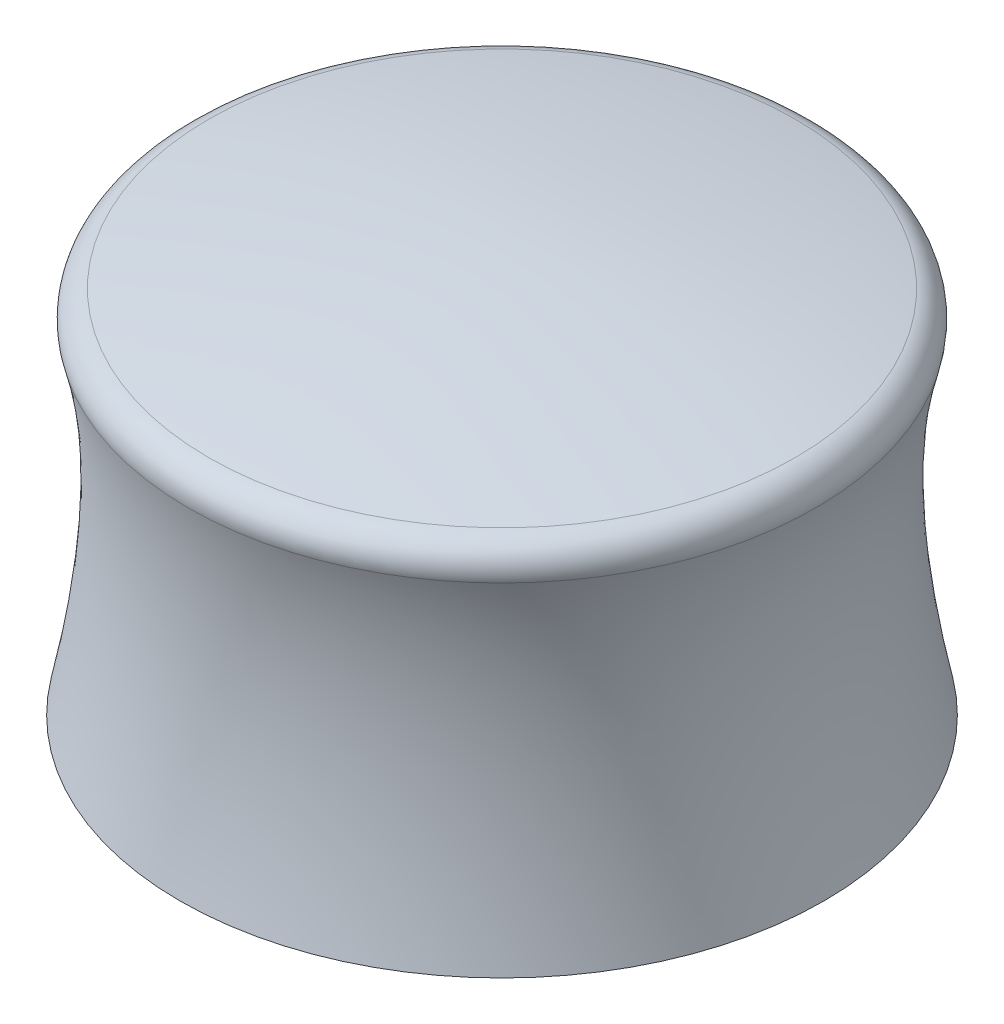
ISO-10303-21;
HEADER;
FILE_DESCRIPTION(('STEP AP214'),'2;1');
FILE_NAME('part.step','',(''),(''),'','','');
FILE_SCHEMA(('AUTOMOTIVE_DESIGN { 1 0 10303 214 1 1 1 1 }'));
ENDSEC;
DATA;
#1=APPLICATION_CONTEXT('core data for automotive mechanical design processes');
#2=APPLICATION_PROTOCOL_DEFINITION('international standard','automotive_design',2000,#1);
#3=PRODUCT_CONTEXT('',#1,'mechanical');
#4=PRODUCT('Part','Part','',(#3));
#5=PRODUCT_RELATED_PRODUCT_CATEGORY('part','',(#4));
#6=PRODUCT_DEFINITION_FORMATION('','',#4);
#7=PRODUCT_DEFINITION_CONTEXT('part definition',#1,'design');
#8=PRODUCT_DEFINITION('design','',#6,#7);
#9=PRODUCT_DEFINITION_SHAPE('','',#8);
#10=(LENGTH_UNIT() NAMED_UNIT(*) SI_UNIT(.MILLI.,.METRE.));
#11=(NAMED_UNIT(*) PLANE_ANGLE_UNIT() SI_UNIT($,.RADIAN.));
#12=(NAMED_UNIT(*) SI_UNIT($,.STERADIAN.) SOLID_ANGLE_UNIT());
#13=UNCERTAINTY_MEASURE_WITH_UNIT(LENGTH_MEASURE(1.E-05),#10,'distance_accuracy_value','');
#14=(GEOMETRIC_REPRESENTATION_CONTEXT(3) GLOBAL_UNCERTAINTY_ASSIGNED_CONTEXT((#13)) GLOBAL_UNIT_ASSIGNED_CONTEXT((#10,
#11,#12)) REPRESENTATION_CONTEXT('',''));
#15=CARTESIAN_POINT('',(0.,0.,0.));
#16=DIRECTION('',(0.,0.,1.));
#17=DIRECTION('',(1.,0.,0.));
#18=AXIS2_PLACEMENT_3D('',#15,#16,#17);
#19=CARTESIAN_POINT('',(0.,-1.,0.));
#20=DIRECTION('',(0.,1.,0.));
#21=DIRECTION('',(0.,0.,1.));
#22=AXIS2_PLACEMENT_3D('',#19,#20,#21);
#23=CYLINDRICAL_SURFACE('',#22,10.);
#24=CARTESIAN_POINT('',(0.,-1.,0.));
#25=DIRECTION('',(0.,1.,0.));
#26=DIRECTION('',(0.,0.,1.));
#27=AXIS2_PLACEMENT_3D('',#24,#25,#26);
#28=CIRCLE('',#27,10.);
#29=CARTESIAN_POINT('',(0.,-1.,10.));
#30=VERTEX_POINT('',#29);
#31=EDGE_CURVE('E65',#30,#30,#28,.T.);
#32=ORIENTED_EDGE('',*,*,#31,.T.);
#33=EDGE_LOOP('',(#32));
#34=FACE_BOUND('',#33,.T.);
#35=CARTESIAN_POINT('',(0.,-0.564405203894367,0.));
#36=DIRECTION('',(0.,1.,0.));
#37=DIRECTION('',(0.,0.,1.));
#38=AXIS2_PLACEMENT_3D('',#35,#36,#37);
#39=CIRCLE('',#38,10.);
#40=CARTESIAN_POINT('',(0.,-0.564405203894368,10.));
#41=VERTEX_POINT('',#40);
#42=EDGE_CURVE('E89',#41,#41,#39,.T.);
#43=ORIENTED_EDGE('',*,*,#42,.F.);
#44=EDGE_LOOP('',(#43));
#45=FACE_BOUND('',#44,.T.);
#46=ADVANCED_FACE('F35',(#34,#45),#23,.T.);
#47=CARTESIAN_POINT('',(0.,-1.,0.));
#48=DIRECTION('',(0.,1.,0.));
#49=DIRECTION('',(0.,0.,1.));
#50=AXIS2_PLACEMENT_3D('',#47,#48,#49);
#51=PLANE('',#50);
#52=CARTESIAN_POINT('',(0.,-1.,0.));
#53=DIRECTION('',(0.,-1.,0.));
#54=DIRECTION('',(0.,0.,-1.));
#55=AXIS2_PLACEMENT_3D('',#52,#53,#54);
#56=CIRCLE('',#55,3.);
#57=CARTESIAN_POINT('',(0.,-1.,-3.));
#58=VERTEX_POINT('',#57);
#59=CARTESIAN_POINT('',(2.59807621135332,-1.,1.5));
#60=VERTEX_POINT('',#59);
#61=EDGE_CURVE('E81',#58,#60,#56,.T.);
#62=ORIENTED_EDGE('',*,*,#61,.F.);
#63=CARTESIAN_POINT('',(0.,-1.,-6.));
#64=DIRECTION('',(0.,1.,0.));
#65=DIRECTION('',(0.,0.,1.));
#66=AXIS2_PLACEMENT_3D('',#63,#64,#65);
#67=CIRCLE('',#66,3.);
#68=EDGE_CURVE('E61',#58,#58,#67,.T.);
#69=ORIENTED_EDGE('',*,*,#68,.T.);
#70=CARTESIAN_POINT('',(-2.59807621135332,-1.,1.5));
#71=VERTEX_POINT('',#70);
#72=EDGE_CURVE('E50',#71,#58,#56,.T.);
#73=ORIENTED_EDGE('',*,*,#72,.F.);
#74=CARTESIAN_POINT('',(-5.19615242270663,-1.,3.));
#75=DIRECTION('',(0.,1.,0.));
#76=DIRECTION('',(0.,0.,1.));
#77=AXIS2_PLACEMENT_3D('',#74,#75,#76);
#78=CIRCLE('',#77,3.);
#79=EDGE_CURVE('E66',#71,#71,#78,.T.);
#80=ORIENTED_EDGE('',*,*,#79,.T.);
#81=EDGE_CURVE('E43',#60,#71,#56,.T.);
#82=ORIENTED_EDGE('',*,*,#81,.F.);
#83=CARTESIAN_POINT('',(5.19615242270663,-1.,3.));
#84=DIRECTION('',(0.,1.,0.));
#85=DIRECTION('',(0.,0.,1.));
#86=AXIS2_PLACEMENT_3D('',#83,#84,#85);
#87=CIRCLE('',#86,3.);
#88=EDGE_CURVE('E71',#60,#60,#87,.T.);
#89=ORIENTED_EDGE('',*,*,#88,.T.);
#90=EDGE_LOOP('',(#62,#69,#73,#80,#82,#89));
#91=FACE_BOUND('',#90,.T.);
#92=ORIENTED_EDGE('',*,*,#31,.F.);
#93=EDGE_LOOP('',(#92));
#94=FACE_BOUND('',#93,.T.);
#95=ADVANCED_FACE('F111',(#91,#94),#51,.F.);
#96=CARTESIAN_POINT('',(0.,-1.,-6.));
#97=DIRECTION('',(0.,1.,0.));
#98=DIRECTION('',(0.,0.,1.));
#99=AXIS2_PLACEMENT_3D('',#96,#97,#98);
#100=CYLINDRICAL_SURFACE('',#99,3.);
#101=ORIENTED_EDGE('',*,*,#68,.F.);
#102=EDGE_LOOP('',(#101));
#103=FACE_BOUND('',#102,.T.);
#104=CARTESIAN_POINT('',(0.,0.,-6.));
#105=DIRECTION('',(0.,-1.,0.));
#106=DIRECTION('',(0.,0.,-1.));
#107=AXIS2_PLACEMENT_3D('',#104,#105,#106);
#108=CIRCLE('',#107,3.);
#109=CARTESIAN_POINT('',(0.,0.,-9.));
#110=VERTEX_POINT('',#109);
#111=EDGE_CURVE('E199',#110,#110,#108,.F.);
#112=ORIENTED_EDGE('',*,*,#111,.T.);
#113=EDGE_LOOP('',(#112));
#114=FACE_BOUND('',#113,.T.);
#115=ADVANCED_FACE('F62',(#103,#114),#100,.F.);
#116=CARTESIAN_POINT('',(-5.19615242270663,-1.,3.));
#117=DIRECTION('',(0.,1.,0.));
#118=DIRECTION('',(0.,0.,1.));
#119=AXIS2_PLACEMENT_3D('',#116,#117,#118);
#120=CYLINDRICAL_SURFACE('',#119,3.);
#121=ORIENTED_EDGE('',*,*,#79,.F.);
#122=EDGE_LOOP('',(#121));
#123=FACE_BOUND('',#122,.T.);
#124=CARTESIAN_POINT('',(-5.19615242270663,0.,3.));
#125=DIRECTION('',(0.,-1.,0.));
#126=DIRECTION('',(0.,0.,-1.));
#127=AXIS2_PLACEMENT_3D('',#124,#125,#126);
#128=CIRCLE('',#127,3.);
#129=CARTESIAN_POINT('',(-5.19615242270663,0.,0.));
#130=VERTEX_POINT('',#129);
#131=EDGE_CURVE('E196',#130,#130,#128,.F.);
#132=ORIENTED_EDGE('',*,*,#131,.T.);
#133=EDGE_LOOP('',(#132));
#134=FACE_BOUND('',#133,.T.);
#135=ADVANCED_FACE('F121',(#123,#134),#120,.F.);
#136=CARTESIAN_POINT('',(5.19615242270663,-1.,3.));
#137=DIRECTION('',(0.,1.,0.));
#138=DIRECTION('',(0.,0.,1.));
#139=AXIS2_PLACEMENT_3D('',#136,#137,#138);
#140=CYLINDRICAL_SURFACE('',#139,3.);
#141=ORIENTED_EDGE('',*,*,#88,.F.);
#142=EDGE_LOOP('',(#141));
#143=FACE_BOUND('',#142,.T.);
#144=CARTESIAN_POINT('',(5.19615242270663,0.,3.));
#145=DIRECTION('',(0.,-1.,0.));
#146=DIRECTION('',(0.,0.,-1.));
#147=AXIS2_PLACEMENT_3D('',#144,#145,#146);
#148=CIRCLE('',#147,3.);
#149=CARTESIAN_POINT('',(5.19615242270663,0.,0.));
#150=VERTEX_POINT('',#149);
#151=EDGE_CURVE('E188',#150,#150,#148,.F.);
#152=ORIENTED_EDGE('',*,*,#151,.T.);
#153=EDGE_LOOP('',(#152));
#154=FACE_BOUND('',#153,.T.);
#155=ADVANCED_FACE('F124',(#143,#154),#140,.F.);
#156=CARTESIAN_POINT('',(0.,0.,0.));
#157=DIRECTION('',(0.,-1.,0.));
#158=DIRECTION('',(0.,0.,-1.));
#159=AXIS2_PLACEMENT_3D('',#156,#157,#158);
#160=PLANE('',#159);
#161=ORIENTED_EDGE('',*,*,#151,.F.);
#162=EDGE_LOOP('',(#161));
#163=FACE_BOUND('',#162,.T.);
#164=ADVANCED_FACE('F128',(#163),#160,.T.);
#165=ORIENTED_EDGE('',*,*,#131,.F.);
#166=EDGE_LOOP('',(#165));
#167=FACE_BOUND('',#166,.T.);
#168=ADVANCED_FACE('F207',(#167),#160,.T.);
#169=ORIENTED_EDGE('',*,*,#111,.F.);
#170=EDGE_LOOP('',(#169));
#171=FACE_BOUND('',#170,.T.);
#172=ADVANCED_FACE('F134',(#171),#160,.T.);
#173=CARTESIAN_POINT('',(0.,0.500289701377899,-3.02265702875752E-05));
#174=CARTESIAN_POINT('',(0.,0.500276220962038,-0.499359380327277));
#175=CARTESIAN_POINT('',(0.,0.476397651333668,-1.48577241939557));
#176=CARTESIAN_POINT('',(0.,0.349231153383247,-3.55350637088178));
#177=CARTESIAN_POINT('',(0.,0.128239639739295,-5.60231361719656));
#178=CARTESIAN_POINT('',(0.,-0.133988179030737,-7.47997570067348));
#179=CARTESIAN_POINT('',(0.,-0.338283309620925,-8.76032691000504));
#180=CARTESIAN_POINT('',(0.,-0.502485262619498,-9.68080117961069));
#181=CARTESIAN_POINT('',(0.,-0.626060977703884,-10.3208190834719));
#182=CARTESIAN_POINT('',(0.,-0.67940891896226,-10.5828420375429));
#183=CARTESIAN_POINT('',(0.,-0.708374179965875,-10.7208461304892));
#184=B_SPLINE_CURVE_WITH_KNOTS('',3,(#173,#174,#175,#176,#177,#178,#179,#180,#181,#182,#183),
.UNSPECIFIED.,.F.,.F.,(4,1,1,1,1,1,1,1,4),(0.,0.0968431133313781,0.193686226662756,
0.387372453325512,0.48421556665689,0.581058679988269,0.677901793319647,0.726323349985336,
0.774744906651025),.UNSPECIFIED.);
#185=CARTESIAN_POINT('',(0.,0.,0.));
#186=DIRECTION('',(0.,1.,0.));
#187=AXIS1_PLACEMENT('',#185,#186);
#188=SURFACE_OF_REVOLUTION('',#184,#187);
#189=CARTESIAN_POINT('',(0.,-0.708374179965876,0.));
#190=DIRECTION('',(0.,1.,0.));
#191=DIRECTION('',(0.,0.,1.));
#192=AXIS2_PLACEMENT_3D('',#189,#190,#191);
#193=CIRCLE('',#192,10.7208461304892);
#194=CARTESIAN_POINT('',(0.,-0.708374179965877,10.7208461304892));
#195=VERTEX_POINT('',#194);
#196=EDGE_CURVE('E185',#195,#195,#193,.T.);
#197=ORIENTED_EDGE('',*,*,#196,.F.);
#198=EDGE_LOOP('',(#197));
#199=FACE_BOUND('',#198,.T.);
#200=ORIENTED_EDGE('',*,*,#42,.T.);
#201=EDGE_LOOP('',(#200));
#202=FACE_BOUND('',#201,.T.);
#203=ADVANCED_FACE('F130',(#199,#202),#188,.T.);
#204=CARTESIAN_POINT('',(0.,-0.708374179965912,-10.7208461304895));
#205=CARTESIAN_POINT('',(0.,-5.41483640057688,-9.43537712996795));
#206=CARTESIAN_POINT('',(0.,-12.5231445500206,-10.7860994861026));
#207=B_SPLINE_CURVE_WITH_KNOTS('',2,(#204,#205,#206),.UNSPECIFIED.,.F.,.F.,(3,3),
(0.0964464073893795,0.931611686936992),.UNSPECIFIED.);
#208=CARTESIAN_POINT('',(0.,0.,0.));
#209=DIRECTION('',(0.,1.,0.));
#210=AXIS1_PLACEMENT('',#208,#209);
#211=SURFACE_OF_REVOLUTION('',#207,#210);
#212=CARTESIAN_POINT('',(0.,-12.5231445500206,0.));
#213=DIRECTION('',(0.,1.,0.));
#214=DIRECTION('',(0.,0.,1.));
#215=AXIS2_PLACEMENT_3D('',#212,#213,#214);
#216=CIRCLE('',#215,10.7860994861026);
#217=CARTESIAN_POINT('',(0.,-12.5231445500206,10.7860994861026));
#218=VERTEX_POINT('',#217);
#219=EDGE_CURVE('E184',#218,#218,#216,.T.);
#220=ORIENTED_EDGE('',*,*,#219,.F.);
#221=EDGE_LOOP('',(#220));
#222=FACE_BOUND('',#221,.T.);
#223=ORIENTED_EDGE('',*,*,#196,.T.);
#224=EDGE_LOOP('',(#223));
#225=FACE_BOUND('',#224,.T.);
#226=ADVANCED_FACE('F133',(#222,#225),#211,.T.);
#227=CARTESIAN_POINT('',(0.,-12.5231445500206,0.));
#228=DIRECTION('',(0.,-1.,0.));
#229=DIRECTION('',(0.,0.,-1.));
#230=AXIS2_PLACEMENT_3D('',#227,#228,#229);
#231=CONICAL_SURFACE('',#230,10.7860994861026,0.215566154741985);
#232=CARTESIAN_POINT('',(0.,-13.5,0.));
#233=DIRECTION('',(0.,1.,0.));
#234=DIRECTION('',(0.,0.,1.));
#235=AXIS2_PLACEMENT_3D('',#232,#233,#234);
#236=CIRCLE('',#235,11.);
#237=CARTESIAN_POINT('',(0.,-13.5,11.));
#238=VERTEX_POINT('',#237);
#239=EDGE_CURVE('E181',#238,#238,#236,.T.);
#240=ORIENTED_EDGE('',*,*,#239,.F.);
#241=EDGE_LOOP('',(#240));
#242=FACE_BOUND('',#241,.T.);
#243=ORIENTED_EDGE('',*,*,#219,.T.);
#244=EDGE_LOOP('',(#243));
#245=FACE_BOUND('',#244,.T.);
#246=ADVANCED_FACE('F170',(#242,#245),#231,.F.);
#247=CARTESIAN_POINT('',(0.,-13.5,0.));
#248=DIRECTION('',(0.,-1.,0.));
#249=DIRECTION('',(0.,0.,-1.));
#250=AXIS2_PLACEMENT_3D('',#247,#248,#249);
#251=PLANE('',#250);
#252=ORIENTED_EDGE('',*,*,#239,.T.);
#253=EDGE_LOOP('',(#252));
#254=FACE_BOUND('',#253,.T.);
#255=CARTESIAN_POINT('',(0.,-13.5,0.));
#256=DIRECTION('',(0.,1.,0.));
#257=DIRECTION('',(0.,0.,1.));
#258=AXIS2_PLACEMENT_3D('',#255,#256,#257);
#259=CIRCLE('',#258,12.);
#260=CARTESIAN_POINT('',(0.,-13.5,12.));
#261=VERTEX_POINT('',#260);
#262=EDGE_CURVE('E190',#261,#261,#259,.T.);
#263=ORIENTED_EDGE('',*,*,#262,.F.);
#264=EDGE_LOOP('',(#263));
#265=FACE_BOUND('',#264,.T.);
#266=ADVANCED_FACE('F167',(#254,#265),#251,.T.);
#267=CARTESIAN_POINT('',(0.,0.,-12.));
#268=CARTESIAN_POINT('',(0.,-4.88539054262179,-10.1873670318849));
#269=CARTESIAN_POINT('',(0.,-13.5,-12.));
#270=B_SPLINE_CURVE_WITH_KNOTS('',2,(#267,#268,#269),.UNSPECIFIED.,.F.,.F.,(3,3),(0.,1.),.UNSPECIFIED.);
#271=CARTESIAN_POINT('',(0.,0.,0.));
#272=DIRECTION('',(0.,1.,0.));
#273=AXIS1_PLACEMENT('',#271,#272);
#274=SURFACE_OF_REVOLUTION('',#270,#273);
#275=CARTESIAN_POINT('',(0.,-0.977045589904345,0.));
#276=DIRECTION('',(0.,1.,0.));
#277=DIRECTION('',(0.,0.,1.));
#278=AXIS2_PLACEMENT_3D('',#275,#276,#277);
#279=CIRCLE('',#278,11.6840780202656);
#280=CARTESIAN_POINT('',(0.,-0.977045589904346,11.6840780202656));
#281=VERTEX_POINT('',#280);
#282=EDGE_CURVE('E76',#281,#281,#279,.F.);
#283=ORIENTED_EDGE('',*,*,#282,.T.);
#284=EDGE_LOOP('',(#283));
#285=FACE_BOUND('',#284,.T.);
#286=ORIENTED_EDGE('',*,*,#262,.T.);
#287=EDGE_LOOP('',(#286));
#288=FACE_BOUND('',#287,.T.);
#289=ADVANCED_FACE('F163',(#285,#288),#274,.F.);
#290=CARTESIAN_POINT('',(0.,1.5,0.));
#291=CARTESIAN_POINT('',(0.,1.5,-5.20375847788203));
#292=CARTESIAN_POINT('',(0.,0.188025837219591,-11.6668603811677));
#293=CARTESIAN_POINT('',(0.,0.,-12.));
#294=B_SPLINE_CURVE_WITH_KNOTS('',3,(#290,#291,#292,#293),.UNSPECIFIED.,.F.,.F.,(4,4),(0.,1.),.UNSPECIFIED.);
#295=CARTESIAN_POINT('',(0.,0.,0.));
#296=DIRECTION('',(0.,1.,0.));
#297=AXIS1_PLACEMENT('',#295,#296);
#298=SURFACE_OF_REVOLUTION('',#294,#297);
#299=CARTESIAN_POINT('',(0.,0.270307104881017,0.));
#300=DIRECTION('',(0.,1.,0.));
#301=DIRECTION('',(0.,0.,1.));
#302=AXIS2_PLACEMENT_3D('',#299,#300,#301);
#303=CIRCLE('',#302,10.9262309952929);
#304=CARTESIAN_POINT('',(0.,0.270307104881016,10.9262309952929));
#305=VERTEX_POINT('',#304);
#306=EDGE_CURVE('E69',#305,#305,#303,.T.);
#307=ORIENTED_EDGE('',*,*,#306,.T.);
#308=EDGE_LOOP('',(#307));
#309=FACE_BOUND('',#308,.T.);
#310=CARTESIAN_POINT('',(0.,1.5,0.));
#311=VERTEX_POINT('',#310);
#312=VERTEX_LOOP('',#311);
#313=FACE_BOUND('',#312,.T.);
#314=ADVANCED_FACE('F107',(#309,#313),#298,.F.);
#315=CARTESIAN_POINT('',(0.,-0.708374179965931,0.));
#316=DIRECTION('',(0.,-1.,0.));
#317=DIRECTION('',(0.,0.,-1.));
#318=AXIS2_PLACEMENT_3D('',#315,#316,#317);
#319=TOROIDAL_SURFACE('',#318,10.7208461304895,1.);
#320=ORIENTED_EDGE('',*,*,#282,.F.);
#321=EDGE_LOOP('',(#320));
#322=FACE_BOUND('',#321,.T.);
#323=ORIENTED_EDGE('',*,*,#306,.F.);
#324=EDGE_LOOP('',(#323));
#325=FACE_BOUND('',#324,.T.);
#326=ADVANCED_FACE('F37',(#322,#325),#319,.T.);
#327=CARTESIAN_POINT('',(0.,-12.,0.));
#328=DIRECTION('',(0.,-1.,0.));
#329=DIRECTION('',(0.,0.,-1.));
#330=AXIS2_PLACEMENT_3D('',#327,#328,#329);
#331=PLANE('',#330);
#332=CARTESIAN_POINT('',(0.,-12.,0.));
#333=DIRECTION('',(0.,-1.,0.));
#334=DIRECTION('',(0.,0.,-1.));
#335=AXIS2_PLACEMENT_3D('',#332,#333,#334);
#336=CIRCLE('',#335,3.);
#337=CARTESIAN_POINT('',(0.,-12.,-3.));
#338=VERTEX_POINT('',#337);
#339=EDGE_CURVE('E86',#338,#338,#336,.T.);
#340=ORIENTED_EDGE('',*,*,#339,.T.);
#341=EDGE_LOOP('',(#340));
#342=FACE_BOUND('',#341,.T.);
#343=CARTESIAN_POINT('',(0.,-12.,0.));
#344=DIRECTION('',(0.,-1.,0.));
#345=DIRECTION('',(0.,0.,-1.));
#346=AXIS2_PLACEMENT_3D('',#343,#344,#345);
#347=CIRCLE('',#346,2.);
#348=CARTESIAN_POINT('',(0.,-12.,-2.));
#349=VERTEX_POINT('',#348);
#350=EDGE_CURVE('E87',#349,#349,#347,.T.);
#351=ORIENTED_EDGE('',*,*,#350,.F.);
#352=EDGE_LOOP('',(#351));
#353=FACE_BOUND('',#352,.T.);
#354=ADVANCED_FACE('F96',(#342,#353),#331,.T.);
#355=CARTESIAN_POINT('',(0.,-12.,0.));
#356=DIRECTION('',(0.,1.,0.));
#357=DIRECTION('',(0.,0.,1.));
#358=AXIS2_PLACEMENT_3D('',#355,#356,#357);
#359=CYLINDRICAL_SURFACE('',#358,3.);
#360=ORIENTED_EDGE('',*,*,#339,.F.);
#361=EDGE_LOOP('',(#360));
#362=FACE_BOUND('',#361,.T.);
#363=ORIENTED_EDGE('',*,*,#61,.T.);
#364=ORIENTED_EDGE('',*,*,#81,.T.);
#365=ORIENTED_EDGE('',*,*,#72,.T.);
#366=EDGE_LOOP('',(#363,#364,#365));
#367=FACE_BOUND('',#366,.T.);
#368=ADVANCED_FACE('F98',(#362,#367),#359,.T.);
#369=CARTESIAN_POINT('',(0.,-12.,0.));
#370=DIRECTION('',(0.,1.,0.));
#371=DIRECTION('',(0.,0.,1.));
#372=AXIS2_PLACEMENT_3D('',#369,#370,#371);
#373=CYLINDRICAL_SURFACE('',#372,2.);
#374=CARTESIAN_POINT('',(0.,-11.,0.));
#375=DIRECTION('',(0.,-1.,0.));
#376=DIRECTION('',(0.,0.,-1.));
#377=AXIS2_PLACEMENT_3D('',#374,#375,#376);
#378=CIRCLE('',#377,2.);
#379=CARTESIAN_POINT('',(0.,-11.,-2.));
#380=VERTEX_POINT('',#379);
#381=EDGE_CURVE('E11',#380,#380,#378,.T.);
#382=ORIENTED_EDGE('',*,*,#381,.F.);
#383=EDGE_LOOP('',(#382));
#384=FACE_BOUND('',#383,.T.);
#385=ORIENTED_EDGE('',*,*,#350,.T.);
#386=EDGE_LOOP('',(#385));
#387=FACE_BOUND('',#386,.T.);
#388=ADVANCED_FACE('F94',(#384,#387),#373,.F.);
#389=CARTESIAN_POINT('',(0.,-11.,0.));
#390=DIRECTION('',(0.,-1.,0.));
#391=DIRECTION('',(0.,0.,-1.));
#392=AXIS2_PLACEMENT_3D('',#389,#390,#391);
#393=PLANE('',#392);
#394=ORIENTED_EDGE('',*,*,#381,.T.);
#395=EDGE_LOOP('',(#394));
#396=FACE_BOUND('',#395,.T.);
#397=ADVANCED_FACE('F301',(#396),#393,.T.);
#398=CLOSED_SHELL('',(#46,#95,#115,#135,#155,#164,#168,#172,#203,#226,#246,#266,#289,#314,#326,
#354,#368,#388,#397));
#399=MANIFOLD_SOLID_BREP('B2',#398);
#400=ADVANCED_BREP_SHAPE_REPRESENTATION('',(#18,#399),#14);
#401=SHAPE_DEFINITION_REPRESENTATION(#9,#400);
ENDSEC;
END-ISO-10303-21;
